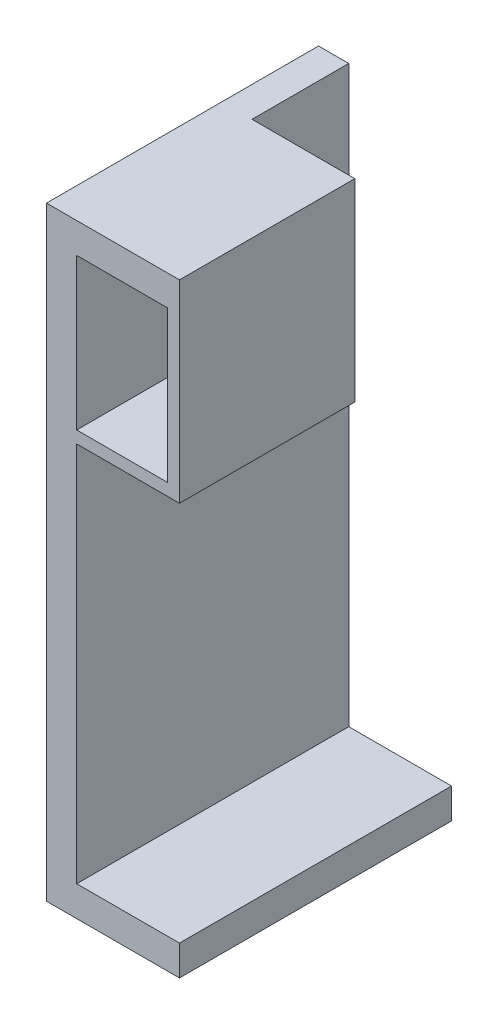
ISO-10303-21;
HEADER;
FILE_DESCRIPTION(('STEP AP214'),'2;1');
FILE_NAME('part.step','',(''),(''),'','','');
FILE_SCHEMA(('AUTOMOTIVE_DESIGN { 1 0 10303 214 1 1 1 1 }'));
ENDSEC;
DATA;
#1=APPLICATION_CONTEXT('core data for automotive mechanical design processes');
#2=APPLICATION_PROTOCOL_DEFINITION('international standard','automotive_design',2000,#1);
#3=PRODUCT_CONTEXT('',#1,'mechanical');
#4=PRODUCT('Part','Part','',(#3));
#5=PRODUCT_RELATED_PRODUCT_CATEGORY('part','',(#4));
#6=PRODUCT_DEFINITION_FORMATION('','',#4);
#7=PRODUCT_DEFINITION_CONTEXT('part definition',#1,'design');
#8=PRODUCT_DEFINITION('design','',#6,#7);
#9=PRODUCT_DEFINITION_SHAPE('','',#8);
#10=(LENGTH_UNIT() NAMED_UNIT(*) SI_UNIT(.MILLI.,.METRE.));
#11=(NAMED_UNIT(*) PLANE_ANGLE_UNIT() SI_UNIT($,.RADIAN.));
#12=(NAMED_UNIT(*) SI_UNIT($,.STERADIAN.) SOLID_ANGLE_UNIT());
#13=UNCERTAINTY_MEASURE_WITH_UNIT(LENGTH_MEASURE(1.E-05),#10,'distance_accuracy_value','');
#14=(GEOMETRIC_REPRESENTATION_CONTEXT(3) GLOBAL_UNCERTAINTY_ASSIGNED_CONTEXT((#13)) GLOBAL_UNIT_ASSIGNED_CONTEXT((#10,
#11,#12)) REPRESENTATION_CONTEXT('',''));
#15=CARTESIAN_POINT('',(0.,0.,0.));
#16=DIRECTION('',(0.,0.,1.));
#17=DIRECTION('',(1.,0.,0.));
#18=AXIS2_PLACEMENT_3D('',#15,#16,#17);
#19=CARTESIAN_POINT('',(0.,0.,0.));
#20=DIRECTION('',(0.,0.,-1.));
#21=DIRECTION('',(-1.,0.,0.));
#22=AXIS2_PLACEMENT_3D('',#19,#20,#21);
#23=PLANE('',#22);
#24=DIRECTION('',(-1.,0.,0.));
#25=VECTOR('',#24,1.);
#26=CARTESIAN_POINT('',(37.5,50.,0.));
#27=LINE('',#26,#25);
#28=CARTESIAN_POINT('',(-32.5,50.,0.));
#29=VERTEX_POINT('',#28);
#30=CARTESIAN_POINT('',(-37.5,50.,0.));
#31=VERTEX_POINT('',#30);
#32=EDGE_CURVE('E154',#29,#31,#27,.T.);
#33=ORIENTED_EDGE('',*,*,#32,.F.);
#34=DIRECTION('',(0.,-1.,0.));
#35=VECTOR('',#34,1.);
#36=CARTESIAN_POINT('',(-32.5,0.,0.));
#37=LINE('',#36,#35);
#38=CARTESIAN_POINT('',(-32.5,-45.,0.));
#39=VERTEX_POINT('',#38);
#40=EDGE_CURVE('E137',#29,#39,#37,.T.);
#41=ORIENTED_EDGE('',*,*,#40,.T.);
#42=DIRECTION('',(1.,0.,0.));
#43=VECTOR('',#42,1.);
#44=CARTESIAN_POINT('',(0.,-45.,0.));
#45=LINE('',#44,#43);
#46=CARTESIAN_POINT('',(-15.5,-45.,0.));
#47=VERTEX_POINT('',#46);
#48=EDGE_CURVE('E135',#39,#47,#45,.T.);
#49=ORIENTED_EDGE('',*,*,#48,.T.);
#50=DIRECTION('',(0.,-1.,0.));
#51=VECTOR('',#50,1.);
#52=CARTESIAN_POINT('',(-15.5,50.,0.));
#53=LINE('',#52,#51);
#54=CARTESIAN_POINT('',(-15.5,-50.,0.));
#55=VERTEX_POINT('',#54);
#56=EDGE_CURVE('E118',#47,#55,#53,.T.);
#57=ORIENTED_EDGE('',*,*,#56,.T.);
#58=DIRECTION('',(1.,0.,0.));
#59=VECTOR('',#58,1.);
#60=CARTESIAN_POINT('',(37.5,-50.,0.));
#61=LINE('',#60,#59);
#62=CARTESIAN_POINT('',(-37.5,-50.,0.));
#63=VERTEX_POINT('',#62);
#64=EDGE_CURVE('E125',#63,#55,#61,.T.);
#65=ORIENTED_EDGE('',*,*,#64,.F.);
#66=DIRECTION('',(0.,-1.,0.));
#67=VECTOR('',#66,1.);
#68=CARTESIAN_POINT('',(-37.5,-50.,0.));
#69=LINE('',#68,#67);
#70=EDGE_CURVE('E148',#31,#63,#69,.T.);
#71=ORIENTED_EDGE('',*,*,#70,.F.);
#72=EDGE_LOOP('',(#33,#41,#49,#57,#65,#71));
#73=FACE_BOUND('',#72,.T.);
#74=ADVANCED_FACE('F75',(#73),#23,.T.);
#75=CARTESIAN_POINT('',(37.5,50.,45.));
#76=DIRECTION('',(0.,-1.,0.));
#77=DIRECTION('',(0.,0.,-1.));
#78=AXIS2_PLACEMENT_3D('',#75,#76,#77);
#79=PLANE('',#78);
#80=DIRECTION('',(0.,0.,-1.));
#81=VECTOR('',#80,1.);
#82=CARTESIAN_POINT('',(-32.5,50.,16.));
#83=LINE('',#82,#81);
#84=CARTESIAN_POINT('',(-32.5,50.,16.));
#85=VERTEX_POINT('',#84);
#86=EDGE_CURVE('E319',#85,#29,#83,.T.);
#87=ORIENTED_EDGE('',*,*,#86,.T.);
#88=ORIENTED_EDGE('',*,*,#32,.T.);
#89=DIRECTION('',(0.,0.,-1.));
#90=VECTOR('',#89,1.);
#91=CARTESIAN_POINT('',(-37.5,50.,45.));
#92=LINE('',#91,#90);
#93=CARTESIAN_POINT('',(-37.5,50.,45.));
#94=VERTEX_POINT('',#93);
#95=EDGE_CURVE('E144',#94,#31,#92,.T.);
#96=ORIENTED_EDGE('',*,*,#95,.F.);
#97=DIRECTION('',(-1.,0.,0.));
#98=VECTOR('',#97,1.);
#99=CARTESIAN_POINT('',(37.5,50.,45.));
#100=LINE('',#99,#98);
#101=CARTESIAN_POINT('',(-15.5,50.,45.));
#102=VERTEX_POINT('',#101);
#103=EDGE_CURVE('E152',#102,#94,#100,.T.);
#104=ORIENTED_EDGE('',*,*,#103,.F.);
#105=DIRECTION('',(0.,0.,1.));
#106=VECTOR('',#105,1.);
#107=CARTESIAN_POINT('',(-15.5,50.,0.));
#108=LINE('',#107,#106);
#109=CARTESIAN_POINT('',(-15.5,50.,16.));
#110=VERTEX_POINT('',#109);
#111=EDGE_CURVE('E85',#110,#102,#108,.T.);
#112=ORIENTED_EDGE('',*,*,#111,.F.);
#113=DIRECTION('',(-1.,0.,0.));
#114=VECTOR('',#113,1.);
#115=CARTESIAN_POINT('',(-15.5,50.,16.));
#116=LINE('',#115,#114);
#117=EDGE_CURVE('E324',#110,#85,#116,.T.);
#118=ORIENTED_EDGE('',*,*,#117,.T.);
#119=EDGE_LOOP('',(#87,#88,#96,#104,#112,#118));
#120=FACE_BOUND('',#119,.T.);
#121=ADVANCED_FACE('F316',(#120),#79,.F.);
#122=CARTESIAN_POINT('',(0.,0.,45.));
#123=DIRECTION('',(0.,0.,-1.));
#124=DIRECTION('',(-1.,0.,0.));
#125=AXIS2_PLACEMENT_3D('',#122,#123,#124);
#126=PLANE('',#125);
#127=DIRECTION('',(1.,0.,0.));
#128=VECTOR('',#127,1.);
#129=CARTESIAN_POINT('',(37.5,-50.,45.));
#130=LINE('',#129,#128);
#131=CARTESIAN_POINT('',(-37.5,-50.,45.));
#132=VERTEX_POINT('',#131);
#133=CARTESIAN_POINT('',(-15.5,-50.,45.));
#134=VERTEX_POINT('',#133);
#135=EDGE_CURVE('E202',#132,#134,#130,.T.);
#136=ORIENTED_EDGE('',*,*,#135,.T.);
#137=DIRECTION('',(0.,-1.,0.));
#138=VECTOR('',#137,1.);
#139=CARTESIAN_POINT('',(-15.5,50.,45.));
#140=LINE('',#139,#138);
#141=CARTESIAN_POINT('',(-15.5,-45.,45.));
#142=VERTEX_POINT('',#141);
#143=EDGE_CURVE('E12',#142,#134,#140,.T.);
#144=ORIENTED_EDGE('',*,*,#143,.F.);
#145=DIRECTION('',(1.,0.,0.));
#146=VECTOR('',#145,1.);
#147=CARTESIAN_POINT('',(0.,-45.,45.));
#148=LINE('',#147,#146);
#149=CARTESIAN_POINT('',(-32.5,-45.,45.));
#150=VERTEX_POINT('',#149);
#151=EDGE_CURVE('E79',#150,#142,#148,.T.);
#152=ORIENTED_EDGE('',*,*,#151,.F.);
#153=DIRECTION('',(0.,-1.,0.));
#154=VECTOR('',#153,1.);
#155=CARTESIAN_POINT('',(-32.5,0.,45.));
#156=LINE('',#155,#154);
#157=CARTESIAN_POINT('',(-32.5,18.,45.));
#158=VERTEX_POINT('',#157);
#159=EDGE_CURVE('E239',#158,#150,#156,.T.);
#160=ORIENTED_EDGE('',*,*,#159,.F.);
#161=DIRECTION('',(-1.,0.,0.));
#162=VECTOR('',#161,1.);
#163=CARTESIAN_POINT('',(0.,18.,45.));
#164=LINE('',#163,#162);
#165=CARTESIAN_POINT('',(-15.5,18.,45.));
#166=VERTEX_POINT('',#165);
#167=EDGE_CURVE('E234',#166,#158,#164,.T.);
#168=ORIENTED_EDGE('',*,*,#167,.F.);
#169=DIRECTION('',(0.,-1.,0.));
#170=VECTOR('',#169,1.);
#171=CARTESIAN_POINT('',(-15.5,0.,45.));
#172=LINE('',#171,#170);
#173=EDGE_CURVE('E164',#102,#166,#172,.T.);
#174=ORIENTED_EDGE('',*,*,#173,.F.);
#175=ORIENTED_EDGE('',*,*,#103,.T.);
#176=DIRECTION('',(0.,-1.,0.));
#177=VECTOR('',#176,1.);
#178=CARTESIAN_POINT('',(-37.5,-50.,45.));
#179=LINE('',#178,#177);
#180=EDGE_CURVE('E197',#94,#132,#179,.T.);
#181=ORIENTED_EDGE('',*,*,#180,.T.);
#182=EDGE_LOOP('',(#136,#144,#152,#160,#168,#174,#175,#181));
#183=FACE_BOUND('',#182,.T.);
#184=DIRECTION('',(1.,0.,0.));
#185=VECTOR('',#184,1.);
#186=CARTESIAN_POINT('',(0.,45.,45.));
#187=LINE('',#186,#185);
#188=CARTESIAN_POINT('',(-32.5,45.,45.));
#189=VERTEX_POINT('',#188);
#190=CARTESIAN_POINT('',(-17.5,45.,45.));
#191=VERTEX_POINT('',#190);
#192=EDGE_CURVE('E187',#189,#191,#187,.T.);
#193=ORIENTED_EDGE('',*,*,#192,.T.);
#194=DIRECTION('',(0.,-1.,0.));
#195=VECTOR('',#194,1.);
#196=CARTESIAN_POINT('',(-17.5,0.,45.));
#197=LINE('',#196,#195);
#198=CARTESIAN_POINT('',(-17.5,20.,45.));
#199=VERTEX_POINT('',#198);
#200=EDGE_CURVE('E138',#191,#199,#197,.T.);
#201=ORIENTED_EDGE('',*,*,#200,.T.);
#202=DIRECTION('',(1.,0.,0.));
#203=VECTOR('',#202,1.);
#204=CARTESIAN_POINT('',(0.,20.,45.));
#205=LINE('',#204,#203);
#206=CARTESIAN_POINT('',(-32.5,20.,45.));
#207=VERTEX_POINT('',#206);
#208=EDGE_CURVE('E175',#207,#199,#205,.T.);
#209=ORIENTED_EDGE('',*,*,#208,.F.);
#210=DIRECTION('',(0.,-1.,0.));
#211=VECTOR('',#210,1.);
#212=CARTESIAN_POINT('',(-32.5,0.,45.));
#213=LINE('',#212,#211);
#214=EDGE_CURVE('E170',#189,#207,#213,.T.);
#215=ORIENTED_EDGE('',*,*,#214,.F.);
#216=EDGE_LOOP('',(#193,#201,#209,#215));
#217=FACE_BOUND('',#216,.T.);
#218=ADVANCED_FACE('F77',(#183,#217),#126,.F.);
#219=CARTESIAN_POINT('',(-37.5,-50.,45.));
#220=DIRECTION('',(1.,0.,0.));
#221=DIRECTION('',(0.,0.,-1.));
#222=AXIS2_PLACEMENT_3D('',#219,#220,#221);
#223=PLANE('',#222);
#224=ORIENTED_EDGE('',*,*,#70,.T.);
#225=DIRECTION('',(0.,0.,-1.));
#226=VECTOR('',#225,1.);
#227=CARTESIAN_POINT('',(-37.5,-50.,45.));
#228=LINE('',#227,#226);
#229=EDGE_CURVE('E124',#132,#63,#228,.T.);
#230=ORIENTED_EDGE('',*,*,#229,.F.);
#231=ORIENTED_EDGE('',*,*,#180,.F.);
#232=ORIENTED_EDGE('',*,*,#95,.T.);
#233=EDGE_LOOP('',(#224,#230,#231,#232));
#234=FACE_BOUND('',#233,.T.);
#235=ADVANCED_FACE('F314',(#234),#223,.F.);
#236=CARTESIAN_POINT('',(37.5,-50.,45.));
#237=DIRECTION('',(0.,1.,0.));
#238=DIRECTION('',(0.,0.,1.));
#239=AXIS2_PLACEMENT_3D('',#236,#237,#238);
#240=PLANE('',#239);
#241=ORIENTED_EDGE('',*,*,#64,.T.);
#242=DIRECTION('',(0.,0.,1.));
#243=VECTOR('',#242,1.);
#244=CARTESIAN_POINT('',(-15.5,-50.,0.));
#245=LINE('',#244,#243);
#246=EDGE_CURVE('E115',#55,#134,#245,.T.);
#247=ORIENTED_EDGE('',*,*,#246,.T.);
#248=ORIENTED_EDGE('',*,*,#135,.F.);
#249=ORIENTED_EDGE('',*,*,#229,.T.);
#250=EDGE_LOOP('',(#241,#247,#248,#249));
#251=FACE_BOUND('',#250,.T.);
#252=ADVANCED_FACE('F141',(#251),#240,.F.);
#253=CARTESIAN_POINT('',(0.,-45.,0.));
#254=DIRECTION('',(0.,-1.,0.));
#255=DIRECTION('',(0.,0.,-1.));
#256=AXIS2_PLACEMENT_3D('',#253,#254,#255);
#257=PLANE('',#256);
#258=ORIENTED_EDGE('',*,*,#151,.T.);
#259=DIRECTION('',(0.,0.,-1.));
#260=VECTOR('',#259,1.);
#261=CARTESIAN_POINT('',(-15.5,-45.,0.));
#262=LINE('',#261,#260);
#263=EDGE_CURVE('E101',#142,#47,#262,.T.);
#264=ORIENTED_EDGE('',*,*,#263,.T.);
#265=ORIENTED_EDGE('',*,*,#48,.F.);
#266=DIRECTION('',(0.,0.,1.));
#267=VECTOR('',#266,1.);
#268=CARTESIAN_POINT('',(-32.5,-45.,0.));
#269=LINE('',#268,#267);
#270=EDGE_CURVE('E199',#39,#150,#269,.T.);
#271=ORIENTED_EDGE('',*,*,#270,.T.);
#272=EDGE_LOOP('',(#258,#264,#265,#271));
#273=FACE_BOUND('',#272,.T.);
#274=ADVANCED_FACE('F365',(#273),#257,.F.);
#275=CARTESIAN_POINT('',(-32.5,0.,0.));
#276=DIRECTION('',(-1.,0.,0.));
#277=DIRECTION('',(0.,-1.,0.));
#278=AXIS2_PLACEMENT_3D('',#275,#276,#277);
#279=PLANE('',#278);
#280=ORIENTED_EDGE('',*,*,#159,.T.);
#281=ORIENTED_EDGE('',*,*,#270,.F.);
#282=ORIENTED_EDGE('',*,*,#40,.F.);
#283=ORIENTED_EDGE('',*,*,#86,.F.);
#284=DIRECTION('',(0.,-1.,0.));
#285=VECTOR('',#284,1.);
#286=CARTESIAN_POINT('',(-32.5,18.,16.));
#287=LINE('',#286,#285);
#288=CARTESIAN_POINT('',(-32.5,45.,16.));
#289=VERTEX_POINT('',#288);
#290=EDGE_CURVE('E329',#85,#289,#287,.T.);
#291=ORIENTED_EDGE('',*,*,#290,.T.);
#292=DIRECTION('',(0.,0.,1.));
#293=VECTOR('',#292,1.);
#294=CARTESIAN_POINT('',(-32.5,45.,0.));
#295=LINE('',#294,#293);
#296=EDGE_CURVE('E166',#289,#189,#295,.T.);
#297=ORIENTED_EDGE('',*,*,#296,.T.);
#298=ORIENTED_EDGE('',*,*,#214,.T.);
#299=DIRECTION('',(0.,0.,1.));
#300=VECTOR('',#299,1.);
#301=CARTESIAN_POINT('',(-32.5,20.,0.));
#302=LINE('',#301,#300);
#303=CARTESIAN_POINT('',(-32.5,20.,16.));
#304=VERTEX_POINT('',#303);
#305=EDGE_CURVE('E171',#304,#207,#302,.T.);
#306=ORIENTED_EDGE('',*,*,#305,.F.);
#307=CARTESIAN_POINT('',(-32.5,18.,16.));
#308=VERTEX_POINT('',#307);
#309=EDGE_CURVE('E93',#304,#308,#287,.T.);
#310=ORIENTED_EDGE('',*,*,#309,.T.);
#311=DIRECTION('',(0.,0.,1.));
#312=VECTOR('',#311,1.);
#313=CARTESIAN_POINT('',(-32.5,18.,0.));
#314=LINE('',#313,#312);
#315=EDGE_CURVE('E235',#308,#158,#314,.T.);
#316=ORIENTED_EDGE('',*,*,#315,.T.);
#317=EDGE_LOOP('',(#280,#281,#282,#283,#291,#297,#298,#306,#310,#316));
#318=FACE_BOUND('',#317,.T.);
#319=ADVANCED_FACE('F266',(#318),#279,.F.);
#320=CARTESIAN_POINT('',(0.,18.,0.));
#321=DIRECTION('',(0.,1.,0.));
#322=DIRECTION('',(0.,0.,1.));
#323=AXIS2_PLACEMENT_3D('',#320,#321,#322);
#324=PLANE('',#323);
#325=ORIENTED_EDGE('',*,*,#315,.F.);
#326=DIRECTION('',(1.,0.,0.));
#327=VECTOR('',#326,1.);
#328=CARTESIAN_POINT('',(-15.5,18.,16.));
#329=LINE('',#328,#327);
#330=CARTESIAN_POINT('',(-15.5,18.,16.));
#331=VERTEX_POINT('',#330);
#332=EDGE_CURVE('E331',#308,#331,#329,.T.);
#333=ORIENTED_EDGE('',*,*,#332,.T.);
#334=DIRECTION('',(0.,0.,1.));
#335=VECTOR('',#334,1.);
#336=CARTESIAN_POINT('',(-15.5,18.,0.));
#337=LINE('',#336,#335);
#338=EDGE_CURVE('E230',#331,#166,#337,.T.);
#339=ORIENTED_EDGE('',*,*,#338,.T.);
#340=ORIENTED_EDGE('',*,*,#167,.T.);
#341=EDGE_LOOP('',(#325,#333,#339,#340));
#342=FACE_BOUND('',#341,.T.);
#343=ADVANCED_FACE('F252',(#342),#324,.F.);
#344=CARTESIAN_POINT('',(-15.5,0.,0.));
#345=DIRECTION('',(-1.,0.,0.));
#346=DIRECTION('',(0.,-1.,0.));
#347=AXIS2_PLACEMENT_3D('',#344,#345,#346);
#348=PLANE('',#347);
#349=ORIENTED_EDGE('',*,*,#338,.F.);
#350=DIRECTION('',(0.,1.,0.));
#351=VECTOR('',#350,1.);
#352=CARTESIAN_POINT('',(-15.5,18.,16.));
#353=LINE('',#352,#351);
#354=EDGE_CURVE('E333',#331,#110,#353,.T.);
#355=ORIENTED_EDGE('',*,*,#354,.T.);
#356=ORIENTED_EDGE('',*,*,#111,.T.);
#357=ORIENTED_EDGE('',*,*,#173,.T.);
#358=EDGE_LOOP('',(#349,#355,#356,#357));
#359=FACE_BOUND('',#358,.T.);
#360=ADVANCED_FACE('F345',(#359),#348,.F.);
#361=CARTESIAN_POINT('',(0.,45.,0.));
#362=DIRECTION('',(0.,-1.,0.));
#363=DIRECTION('',(1.,0.,0.));
#364=AXIS2_PLACEMENT_3D('',#361,#362,#363);
#365=PLANE('',#364);
#366=DIRECTION('',(-1.,0.,0.));
#367=VECTOR('',#366,1.);
#368=CARTESIAN_POINT('',(0.,45.,16.));
#369=LINE('',#368,#367);
#370=CARTESIAN_POINT('',(-17.5,45.,16.));
#371=VERTEX_POINT('',#370);
#372=EDGE_CURVE('E204',#371,#289,#369,.T.);
#373=ORIENTED_EDGE('',*,*,#372,.F.);
#374=DIRECTION('',(0.,0.,1.));
#375=VECTOR('',#374,1.);
#376=CARTESIAN_POINT('',(-17.5,45.,0.));
#377=LINE('',#376,#375);
#378=EDGE_CURVE('E180',#371,#191,#377,.T.);
#379=ORIENTED_EDGE('',*,*,#378,.T.);
#380=ORIENTED_EDGE('',*,*,#192,.F.);
#381=ORIENTED_EDGE('',*,*,#296,.F.);
#382=EDGE_LOOP('',(#373,#379,#380,#381));
#383=FACE_BOUND('',#382,.T.);
#384=ADVANCED_FACE('F297',(#383),#365,.T.);
#385=CARTESIAN_POINT('',(-17.5,0.,0.));
#386=DIRECTION('',(-1.,0.,0.));
#387=DIRECTION('',(0.,-1.,0.));
#388=AXIS2_PLACEMENT_3D('',#385,#386,#387);
#389=PLANE('',#388);
#390=DIRECTION('',(0.,1.,0.));
#391=VECTOR('',#390,1.);
#392=CARTESIAN_POINT('',(-17.5,0.,16.));
#393=LINE('',#392,#391);
#394=CARTESIAN_POINT('',(-17.5,20.,16.));
#395=VERTEX_POINT('',#394);
#396=EDGE_CURVE('E211',#395,#371,#393,.T.);
#397=ORIENTED_EDGE('',*,*,#396,.F.);
#398=DIRECTION('',(0.,0.,1.));
#399=VECTOR('',#398,1.);
#400=CARTESIAN_POINT('',(-17.5,20.,0.));
#401=LINE('',#400,#399);
#402=EDGE_CURVE('E176',#395,#199,#401,.T.);
#403=ORIENTED_EDGE('',*,*,#402,.T.);
#404=ORIENTED_EDGE('',*,*,#200,.F.);
#405=ORIENTED_EDGE('',*,*,#378,.F.);
#406=EDGE_LOOP('',(#397,#403,#404,#405));
#407=FACE_BOUND('',#406,.T.);
#408=ADVANCED_FACE('F292',(#407),#389,.T.);
#409=CARTESIAN_POINT('',(0.,20.,0.));
#410=DIRECTION('',(0.,-1.,0.));
#411=DIRECTION('',(0.,0.,-1.));
#412=AXIS2_PLACEMENT_3D('',#409,#410,#411);
#413=PLANE('',#412);
#414=ORIENTED_EDGE('',*,*,#402,.F.);
#415=DIRECTION('',(-1.,0.,0.));
#416=VECTOR('',#415,1.);
#417=CARTESIAN_POINT('',(0.,20.,16.));
#418=LINE('',#417,#416);
#419=EDGE_CURVE('E219',#395,#304,#418,.T.);
#420=ORIENTED_EDGE('',*,*,#419,.T.);
#421=ORIENTED_EDGE('',*,*,#305,.T.);
#422=ORIENTED_EDGE('',*,*,#208,.T.);
#423=EDGE_LOOP('',(#414,#420,#421,#422));
#424=FACE_BOUND('',#423,.T.);
#425=ADVANCED_FACE('F286',(#424),#413,.F.);
#426=CARTESIAN_POINT('',(-15.5,50.,0.));
#427=DIRECTION('',(-1.,0.,0.));
#428=DIRECTION('',(0.,-1.,0.));
#429=AXIS2_PLACEMENT_3D('',#426,#427,#428);
#430=PLANE('',#429);
#431=ORIENTED_EDGE('',*,*,#143,.T.);
#432=ORIENTED_EDGE('',*,*,#246,.F.);
#433=ORIENTED_EDGE('',*,*,#56,.F.);
#434=ORIENTED_EDGE('',*,*,#263,.F.);
#435=EDGE_LOOP('',(#431,#432,#433,#434));
#436=FACE_BOUND('',#435,.T.);
#437=ADVANCED_FACE('F117',(#436),#430,.F.);
#438=CARTESIAN_POINT('',(0.,0.,16.));
#439=DIRECTION('',(0.,0.,1.));
#440=DIRECTION('',(1.,0.,0.));
#441=AXIS2_PLACEMENT_3D('',#438,#439,#440);
#442=PLANE('',#441);
#443=ORIENTED_EDGE('',*,*,#372,.T.);
#444=ORIENTED_EDGE('',*,*,#290,.F.);
#445=ORIENTED_EDGE('',*,*,#117,.F.);
#446=ORIENTED_EDGE('',*,*,#354,.F.);
#447=ORIENTED_EDGE('',*,*,#332,.F.);
#448=ORIENTED_EDGE('',*,*,#309,.F.);
#449=ORIENTED_EDGE('',*,*,#419,.F.);
#450=ORIENTED_EDGE('',*,*,#396,.T.);
#451=EDGE_LOOP('',(#443,#444,#445,#446,#447,#448,#449,#450));
#452=FACE_BOUND('',#451,.T.);
#453=ADVANCED_FACE('F332',(#452),#442,.F.);
#454=CLOSED_SHELL('',(#74,#121,#218,#235,#252,#274,#319,#343,#360,#384,#408,#425,#437,#453));
#455=MANIFOLD_SOLID_BREP('B2',#454);
#456=ADVANCED_BREP_SHAPE_REPRESENTATION('',(#18,#455),#14);
#457=SHAPE_DEFINITION_REPRESENTATION(#9,#456);
ENDSEC;
END-ISO-10303-21;
